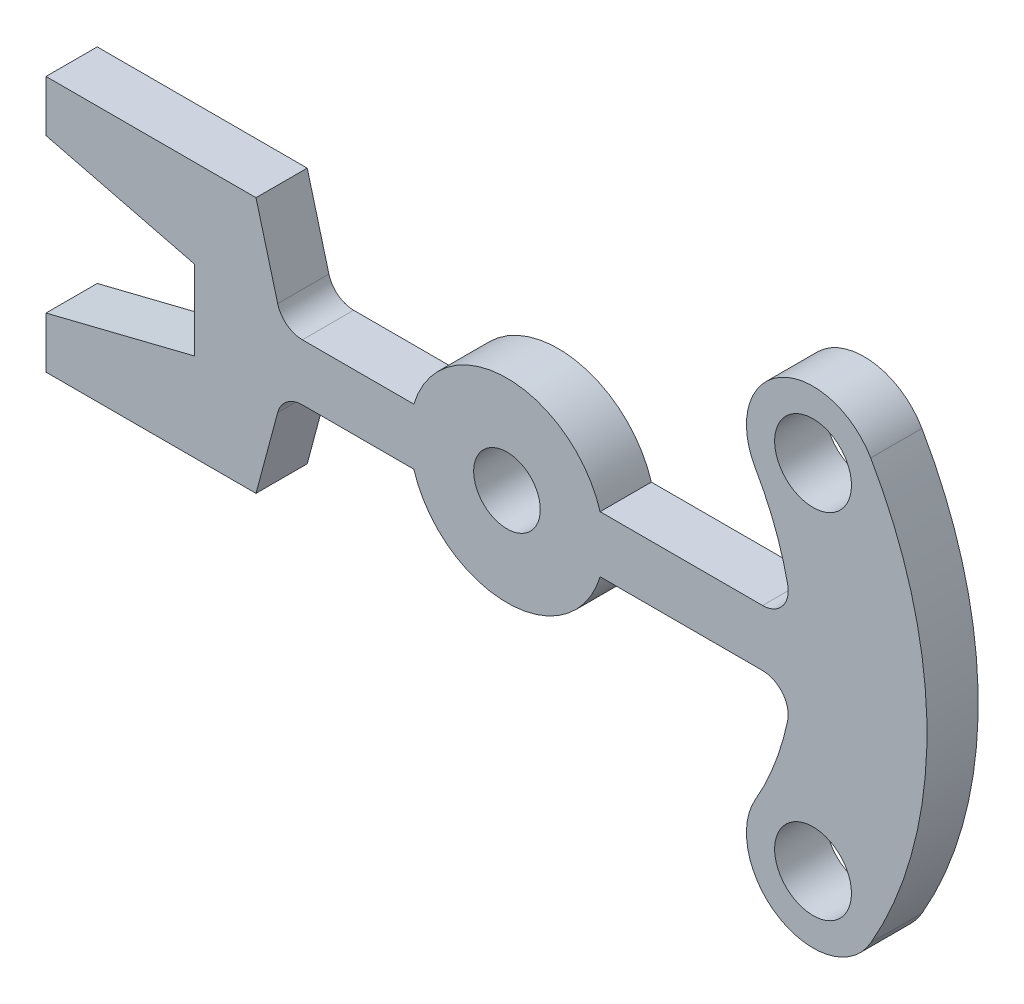
ISO-10303-21;
HEADER;
FILE_DESCRIPTION(('STEP AP214'),'2;1');
FILE_NAME('part.step','',(''),(''),'','','');
FILE_SCHEMA(('AUTOMOTIVE_DESIGN { 1 0 10303 214 1 1 1 1 }'));
ENDSEC;
DATA;
#1=APPLICATION_CONTEXT('core data for automotive mechanical design processes');
#2=APPLICATION_PROTOCOL_DEFINITION('international standard','automotive_design',2000,#1);
#3=PRODUCT_CONTEXT('',#1,'mechanical');
#4=PRODUCT('Part','Part','',(#3));
#5=PRODUCT_RELATED_PRODUCT_CATEGORY('part','',(#4));
#6=PRODUCT_DEFINITION_FORMATION('','',#4);
#7=PRODUCT_DEFINITION_CONTEXT('part definition',#1,'design');
#8=PRODUCT_DEFINITION('design','',#6,#7);
#9=PRODUCT_DEFINITION_SHAPE('','',#8);
#10=(LENGTH_UNIT() NAMED_UNIT(*) SI_UNIT(.MILLI.,.METRE.));
#11=(NAMED_UNIT(*) PLANE_ANGLE_UNIT() SI_UNIT($,.RADIAN.));
#12=(NAMED_UNIT(*) SI_UNIT($,.STERADIAN.) SOLID_ANGLE_UNIT());
#13=UNCERTAINTY_MEASURE_WITH_UNIT(LENGTH_MEASURE(1.E-05),#10,'distance_accuracy_value','');
#14=(GEOMETRIC_REPRESENTATION_CONTEXT(3) GLOBAL_UNCERTAINTY_ASSIGNED_CONTEXT((#13)) GLOBAL_UNIT_ASSIGNED_CONTEXT((#10,
#11,#12)) REPRESENTATION_CONTEXT('',''));
#15=CARTESIAN_POINT('',(0.,0.,0.));
#16=DIRECTION('',(0.,0.,1.));
#17=DIRECTION('',(1.,0.,0.));
#18=AXIS2_PLACEMENT_3D('',#15,#16,#17);
#19=CARTESIAN_POINT('',(0.,0.,10.));
#20=DIRECTION('',(0.,0.,-1.));
#21=DIRECTION('',(-1.,0.,0.));
#22=AXIS2_PLACEMENT_3D('',#19,#20,#21);
#23=CYLINDRICAL_SURFACE('',#22,19.);
#24=CARTESIAN_POINT('',(0.,0.,0.));
#25=DIRECTION('',(0.,0.,1.));
#26=DIRECTION('',(1.,0.,0.));
#27=AXIS2_PLACEMENT_3D('',#24,#25,#26);
#28=CIRCLE('',#27,19.);
#29=CARTESIAN_POINT('',(18.1865334794732,-5.5,0.));
#30=VERTEX_POINT('',#29);
#31=CARTESIAN_POINT('',(-18.1865334794732,-5.5,0.));
#32=VERTEX_POINT('',#31);
#33=EDGE_CURVE('E236',#30,#32,#28,.F.);
#34=ORIENTED_EDGE('',*,*,#33,.F.);
#35=DIRECTION('',(0.,0.,-1.));
#36=VECTOR('',#35,1.);
#37=CARTESIAN_POINT('',(18.1865334794732,-5.5,10.));
#38=LINE('',#37,#36);
#39=CARTESIAN_POINT('',(18.1865334794732,-5.5,10.));
#40=VERTEX_POINT('',#39);
#41=EDGE_CURVE('E11',#40,#30,#38,.T.);
#42=ORIENTED_EDGE('',*,*,#41,.F.);
#43=CARTESIAN_POINT('',(0.,0.,10.));
#44=DIRECTION('',(0.,0.,1.));
#45=DIRECTION('',(1.,0.,0.));
#46=AXIS2_PLACEMENT_3D('',#43,#44,#45);
#47=CIRCLE('',#46,19.);
#48=CARTESIAN_POINT('',(-18.1865334794732,-5.5,10.));
#49=VERTEX_POINT('',#48);
#50=EDGE_CURVE('E306',#40,#49,#47,.F.);
#51=ORIENTED_EDGE('',*,*,#50,.T.);
#52=DIRECTION('',(0.,0.,-1.));
#53=VECTOR('',#52,1.);
#54=CARTESIAN_POINT('',(-18.1865334794732,-5.5,10.));
#55=LINE('',#54,#53);
#56=EDGE_CURVE('E51',#49,#32,#55,.T.);
#57=ORIENTED_EDGE('',*,*,#56,.T.);
#58=EDGE_LOOP('',(#34,#42,#51,#57));
#59=FACE_BOUND('',#58,.T.);
#60=ADVANCED_FACE('F35',(#59),#23,.T.);
#61=CARTESIAN_POINT('',(0.,-5.5,10.));
#62=DIRECTION('',(0.,1.,0.));
#63=DIRECTION('',(-1.,0.,0.));
#64=AXIS2_PLACEMENT_3D('',#61,#62,#63);
#65=PLANE('',#64);
#66=DIRECTION('',(1.,0.,0.));
#67=VECTOR('',#66,1.);
#68=CARTESIAN_POINT('',(0.,-5.5,0.));
#69=LINE('',#68,#67);
#70=CARTESIAN_POINT('',(49.9074142788424,-5.5,0.));
#71=VERTEX_POINT('',#70);
#72=EDGE_CURVE('E238',#30,#71,#69,.T.);
#73=ORIENTED_EDGE('',*,*,#72,.T.);
#74=DIRECTION('',(0.,0.,-1.));
#75=VECTOR('',#74,1.);
#76=CARTESIAN_POINT('',(49.9074142788424,-5.5,10.));
#77=LINE('',#76,#75);
#78=CARTESIAN_POINT('',(49.9074142788424,-5.5,10.));
#79=VERTEX_POINT('',#78);
#80=EDGE_CURVE('E43',#79,#71,#77,.T.);
#81=ORIENTED_EDGE('',*,*,#80,.F.);
#82=DIRECTION('',(1.,0.,0.));
#83=VECTOR('',#82,1.);
#84=CARTESIAN_POINT('',(0.,-5.5,10.));
#85=LINE('',#84,#83);
#86=EDGE_CURVE('E377',#40,#79,#85,.T.);
#87=ORIENTED_EDGE('',*,*,#86,.F.);
#88=ORIENTED_EDGE('',*,*,#41,.T.);
#89=EDGE_LOOP('',(#73,#81,#87,#88));
#90=FACE_BOUND('',#89,.T.);
#91=ADVANCED_FACE('F439',(#90),#65,.F.);
#92=CARTESIAN_POINT('',(49.9074142788424,-10.5,10.));
#93=DIRECTION('',(0.,0.,-1.));
#94=DIRECTION('',(-1.,0.,0.));
#95=AXIS2_PLACEMENT_3D('',#92,#93,#94);
#96=CYLINDRICAL_SURFACE('',#95,4.99999999999999);
#97=CARTESIAN_POINT('',(49.9074142788424,-10.5,0.));
#98=DIRECTION('',(0.,0.,1.));
#99=DIRECTION('',(1.,0.,0.));
#100=AXIS2_PLACEMENT_3D('',#97,#98,#99);
#101=CIRCLE('',#100,4.99999999999999);
#102=CARTESIAN_POINT('',(54.8002980316701,-11.5294117647059,0.));
#103=VERTEX_POINT('',#102);
#104=EDGE_CURVE('E240',#71,#103,#101,.F.);
#105=ORIENTED_EDGE('',*,*,#104,.T.);
#106=DIRECTION('',(0.,0.,-1.));
#107=VECTOR('',#106,1.);
#108=CARTESIAN_POINT('',(54.8002980316701,-11.5294117647059,10.));
#109=LINE('',#108,#107);
#110=CARTESIAN_POINT('',(54.8002980316701,-11.5294117647059,10.));
#111=VERTEX_POINT('',#110);
#112=EDGE_CURVE('E348',#111,#103,#109,.T.);
#113=ORIENTED_EDGE('',*,*,#112,.F.);
#114=CARTESIAN_POINT('',(49.9074142788424,-10.5,10.));
#115=DIRECTION('',(0.,0.,1.));
#116=DIRECTION('',(1.,0.,0.));
#117=AXIS2_PLACEMENT_3D('',#114,#115,#116);
#118=CIRCLE('',#117,4.99999999999999);
#119=EDGE_CURVE('E357',#79,#111,#118,.F.);
#120=ORIENTED_EDGE('',*,*,#119,.F.);
#121=ORIENTED_EDGE('',*,*,#80,.T.);
#122=EDGE_LOOP('',(#105,#113,#120,#121));
#123=FACE_BOUND('',#122,.T.);
#124=ADVANCED_FACE('F355',(#123),#96,.F.);
#125=CARTESIAN_POINT('',(0.,0.,10.));
#126=DIRECTION('',(0.,0.,-1.));
#127=DIRECTION('',(-1.,0.,0.));
#128=AXIS2_PLACEMENT_3D('',#125,#126,#127);
#129=CYLINDRICAL_SURFACE('',#128,56.);
#130=CARTESIAN_POINT('',(0.,0.,0.));
#131=DIRECTION('',(0.,0.,1.));
#132=DIRECTION('',(1.,0.,0.));
#133=AXIS2_PLACEMENT_3D('',#130,#131,#132);
#134=CIRCLE('',#133,56.);
#135=CARTESIAN_POINT('',(48.4974226119285,-28.0000000000001,0.));
#136=VERTEX_POINT('',#135);
#137=EDGE_CURVE('E242',#103,#136,#134,.F.);
#138=ORIENTED_EDGE('',*,*,#137,.T.);
#139=DIRECTION('',(0.,0.,-1.));
#140=VECTOR('',#139,1.);
#141=CARTESIAN_POINT('',(48.4974226119285,-28.0000000000001,10.));
#142=LINE('',#141,#140);
#143=CARTESIAN_POINT('',(48.4974226119285,-28.0000000000001,10.));
#144=VERTEX_POINT('',#143);
#145=EDGE_CURVE('E346',#144,#136,#142,.T.);
#146=ORIENTED_EDGE('',*,*,#145,.F.);
#147=CARTESIAN_POINT('',(0.,0.,10.));
#148=DIRECTION('',(0.,0.,1.));
#149=DIRECTION('',(1.,0.,0.));
#150=AXIS2_PLACEMENT_3D('',#147,#148,#149);
#151=CIRCLE('',#150,56.);
#152=EDGE_CURVE('E371',#111,#144,#151,.F.);
#153=ORIENTED_EDGE('',*,*,#152,.F.);
#154=ORIENTED_EDGE('',*,*,#112,.T.);
#155=EDGE_LOOP('',(#138,#146,#153,#154));
#156=FACE_BOUND('',#155,.T.);
#157=ADVANCED_FACE('F368',(#156),#129,.F.);
#158=CARTESIAN_POINT('',(59.7557528611262,-34.5000000000001,10.));
#159=DIRECTION('',(0.,0.,-1.));
#160=DIRECTION('',(-1.,0.,0.));
#161=AXIS2_PLACEMENT_3D('',#158,#159,#160);
#162=CYLINDRICAL_SURFACE('',#161,13.);
#163=CARTESIAN_POINT('',(59.7557528611262,-34.5000000000001,0.));
#164=DIRECTION('',(0.,0.,1.));
#165=DIRECTION('',(1.,0.,0.));
#166=AXIS2_PLACEMENT_3D('',#163,#164,#165);
#167=CIRCLE('',#166,13.);
#168=CARTESIAN_POINT('',(71.0140831103239,-41.0000000000001,0.));
#169=VERTEX_POINT('',#168);
#170=EDGE_CURVE('E245',#169,#136,#167,.F.);
#171=ORIENTED_EDGE('',*,*,#170,.F.);
#172=DIRECTION('',(0.,0.,-1.));
#173=VECTOR('',#172,1.);
#174=CARTESIAN_POINT('',(71.0140831103239,-41.0000000000001,10.));
#175=LINE('',#174,#173);
#176=CARTESIAN_POINT('',(71.0140831103239,-41.0000000000001,10.));
#177=VERTEX_POINT('',#176);
#178=EDGE_CURVE('E344',#177,#169,#175,.T.);
#179=ORIENTED_EDGE('',*,*,#178,.F.);
#180=CARTESIAN_POINT('',(59.7557528611262,-34.5000000000001,10.));
#181=DIRECTION('',(0.,0.,1.));
#182=DIRECTION('',(1.,0.,0.));
#183=AXIS2_PLACEMENT_3D('',#180,#181,#182);
#184=CIRCLE('',#183,13.);
#185=EDGE_CURVE('E373',#177,#144,#184,.F.);
#186=ORIENTED_EDGE('',*,*,#185,.T.);
#187=ORIENTED_EDGE('',*,*,#145,.T.);
#188=EDGE_LOOP('',(#171,#179,#186,#187));
#189=FACE_BOUND('',#188,.T.);
#190=ADVANCED_FACE('F659',(#189),#162,.T.);
#191=CARTESIAN_POINT('',(0.,0.,10.));
#192=DIRECTION('',(0.,0.,-1.));
#193=DIRECTION('',(-1.,0.,0.));
#194=AXIS2_PLACEMENT_3D('',#191,#192,#193);
#195=CYLINDRICAL_SURFACE('',#194,82.);
#196=CARTESIAN_POINT('',(0.,0.,0.));
#197=DIRECTION('',(0.,0.,1.));
#198=DIRECTION('',(1.,0.,0.));
#199=AXIS2_PLACEMENT_3D('',#196,#197,#198);
#200=CIRCLE('',#199,82.);
#201=CARTESIAN_POINT('',(71.0140831103239,41.0000000000001,0.));
#202=VERTEX_POINT('',#201);
#203=EDGE_CURVE('E248',#169,#202,#200,.T.);
#204=ORIENTED_EDGE('',*,*,#203,.T.);
#205=DIRECTION('',(0.,0.,-1.));
#206=VECTOR('',#205,1.);
#207=CARTESIAN_POINT('',(71.0140831103239,41.0000000000001,10.));
#208=LINE('',#207,#206);
#209=CARTESIAN_POINT('',(71.0140831103239,41.0000000000001,10.));
#210=VERTEX_POINT('',#209);
#211=EDGE_CURVE('E341',#210,#202,#208,.T.);
#212=ORIENTED_EDGE('',*,*,#211,.F.);
#213=CARTESIAN_POINT('',(0.,0.,10.));
#214=DIRECTION('',(0.,0.,1.));
#215=DIRECTION('',(1.,0.,0.));
#216=AXIS2_PLACEMENT_3D('',#213,#214,#215);
#217=CIRCLE('',#216,82.);
#218=EDGE_CURVE('E375',#177,#210,#217,.T.);
#219=ORIENTED_EDGE('',*,*,#218,.F.);
#220=ORIENTED_EDGE('',*,*,#178,.T.);
#221=EDGE_LOOP('',(#204,#212,#219,#220));
#222=FACE_BOUND('',#221,.T.);
#223=ADVANCED_FACE('F649',(#222),#195,.T.);
#224=CARTESIAN_POINT('',(59.7557528611262,34.5000000000001,10.));
#225=DIRECTION('',(0.,0.,-1.));
#226=DIRECTION('',(-1.,0.,0.));
#227=AXIS2_PLACEMENT_3D('',#224,#225,#226);
#228=CYLINDRICAL_SURFACE('',#227,13.);
#229=CARTESIAN_POINT('',(59.7557528611262,34.5000000000001,0.));
#230=DIRECTION('',(0.,0.,1.));
#231=DIRECTION('',(1.,0.,0.));
#232=AXIS2_PLACEMENT_3D('',#229,#230,#231);
#233=CIRCLE('',#232,13.);
#234=CARTESIAN_POINT('',(48.4974226119285,28.0000000000001,0.));
#235=VERTEX_POINT('',#234);
#236=EDGE_CURVE('E250',#202,#235,#233,.T.);
#237=ORIENTED_EDGE('',*,*,#236,.T.);
#238=DIRECTION('',(0.,0.,-1.));
#239=VECTOR('',#238,1.);
#240=CARTESIAN_POINT('',(48.4974226119285,28.0000000000001,10.));
#241=LINE('',#240,#239);
#242=CARTESIAN_POINT('',(48.4974226119285,28.0000000000001,10.));
#243=VERTEX_POINT('',#242);
#244=EDGE_CURVE('E339',#243,#235,#241,.T.);
#245=ORIENTED_EDGE('',*,*,#244,.F.);
#246=CARTESIAN_POINT('',(59.7557528611262,34.5000000000001,10.));
#247=DIRECTION('',(0.,0.,1.));
#248=DIRECTION('',(1.,0.,0.));
#249=AXIS2_PLACEMENT_3D('',#246,#247,#248);
#250=CIRCLE('',#249,13.);
#251=EDGE_CURVE('E382',#210,#243,#250,.T.);
#252=ORIENTED_EDGE('',*,*,#251,.F.);
#253=ORIENTED_EDGE('',*,*,#211,.T.);
#254=EDGE_LOOP('',(#237,#245,#252,#253));
#255=FACE_BOUND('',#254,.T.);
#256=ADVANCED_FACE('F639',(#255),#228,.T.);
#257=CARTESIAN_POINT('',(0.,0.,10.));
#258=DIRECTION('',(0.,0.,-1.));
#259=DIRECTION('',(-1.,0.,0.));
#260=AXIS2_PLACEMENT_3D('',#257,#258,#259);
#261=CYLINDRICAL_SURFACE('',#260,56.);
#262=CARTESIAN_POINT('',(0.,0.,0.));
#263=DIRECTION('',(0.,0.,1.));
#264=DIRECTION('',(1.,0.,0.));
#265=AXIS2_PLACEMENT_3D('',#262,#263,#264);
#266=CIRCLE('',#265,56.);
#267=CARTESIAN_POINT('',(54.8002980316701,11.5294117647059,0.));
#268=VERTEX_POINT('',#267);
#269=EDGE_CURVE('E253',#268,#235,#266,.T.);
#270=ORIENTED_EDGE('',*,*,#269,.F.);
#271=DIRECTION('',(0.,0.,-1.));
#272=VECTOR('',#271,1.);
#273=CARTESIAN_POINT('',(54.8002980316701,11.5294117647059,10.));
#274=LINE('',#273,#272);
#275=CARTESIAN_POINT('',(54.8002980316701,11.5294117647059,10.));
#276=VERTEX_POINT('',#275);
#277=EDGE_CURVE('E337',#276,#268,#274,.T.);
#278=ORIENTED_EDGE('',*,*,#277,.F.);
#279=CARTESIAN_POINT('',(0.,0.,10.));
#280=DIRECTION('',(0.,0.,1.));
#281=DIRECTION('',(1.,0.,0.));
#282=AXIS2_PLACEMENT_3D('',#279,#280,#281);
#283=CIRCLE('',#282,56.);
#284=EDGE_CURVE('E384',#276,#243,#283,.T.);
#285=ORIENTED_EDGE('',*,*,#284,.T.);
#286=ORIENTED_EDGE('',*,*,#244,.T.);
#287=EDGE_LOOP('',(#270,#278,#285,#286));
#288=FACE_BOUND('',#287,.T.);
#289=ADVANCED_FACE('F629',(#288),#261,.F.);
#290=CARTESIAN_POINT('',(49.9074142788424,10.5,10.));
#291=DIRECTION('',(0.,0.,-1.));
#292=DIRECTION('',(-1.,0.,0.));
#293=AXIS2_PLACEMENT_3D('',#290,#291,#292);
#294=CYLINDRICAL_SURFACE('',#293,4.99999999999999);
#295=CARTESIAN_POINT('',(49.9074142788424,10.5,0.));
#296=DIRECTION('',(0.,0.,1.));
#297=DIRECTION('',(1.,0.,0.));
#298=AXIS2_PLACEMENT_3D('',#295,#296,#297);
#299=CIRCLE('',#298,4.99999999999999);
#300=CARTESIAN_POINT('',(49.9074142788424,5.5,0.));
#301=VERTEX_POINT('',#300);
#302=EDGE_CURVE('E256',#301,#268,#299,.T.);
#303=ORIENTED_EDGE('',*,*,#302,.F.);
#304=DIRECTION('',(0.,0.,-1.));
#305=VECTOR('',#304,1.);
#306=CARTESIAN_POINT('',(49.9074142788424,5.5,10.));
#307=LINE('',#306,#305);
#308=CARTESIAN_POINT('',(49.9074142788424,5.5,10.));
#309=VERTEX_POINT('',#308);
#310=EDGE_CURVE('E335',#309,#301,#307,.T.);
#311=ORIENTED_EDGE('',*,*,#310,.F.);
#312=CARTESIAN_POINT('',(49.9074142788424,10.5,10.));
#313=DIRECTION('',(0.,0.,1.));
#314=DIRECTION('',(1.,0.,0.));
#315=AXIS2_PLACEMENT_3D('',#312,#313,#314);
#316=CIRCLE('',#315,4.99999999999999);
#317=EDGE_CURVE('E387',#309,#276,#316,.T.);
#318=ORIENTED_EDGE('',*,*,#317,.T.);
#319=ORIENTED_EDGE('',*,*,#277,.T.);
#320=EDGE_LOOP('',(#303,#311,#318,#319));
#321=FACE_BOUND('',#320,.T.);
#322=ADVANCED_FACE('F619',(#321),#294,.F.);
#323=CARTESIAN_POINT('',(0.,5.5,10.));
#324=DIRECTION('',(0.,1.,0.));
#325=DIRECTION('',(-1.,0.,0.));
#326=AXIS2_PLACEMENT_3D('',#323,#324,#325);
#327=PLANE('',#326);
#328=DIRECTION('',(1.,0.,0.));
#329=VECTOR('',#328,1.);
#330=CARTESIAN_POINT('',(0.,5.5,0.));
#331=LINE('',#330,#329);
#332=CARTESIAN_POINT('',(18.1865334794732,5.5,0.));
#333=VERTEX_POINT('',#332);
#334=EDGE_CURVE('E259',#333,#301,#331,.T.);
#335=ORIENTED_EDGE('',*,*,#334,.F.);
#336=DIRECTION('',(0.,0.,-1.));
#337=VECTOR('',#336,1.);
#338=CARTESIAN_POINT('',(18.1865334794732,5.5,10.));
#339=LINE('',#338,#337);
#340=CARTESIAN_POINT('',(18.1865334794732,5.5,10.));
#341=VERTEX_POINT('',#340);
#342=EDGE_CURVE('E333',#341,#333,#339,.T.);
#343=ORIENTED_EDGE('',*,*,#342,.F.);
#344=DIRECTION('',(1.,0.,0.));
#345=VECTOR('',#344,1.);
#346=CARTESIAN_POINT('',(0.,5.5,10.));
#347=LINE('',#346,#345);
#348=EDGE_CURVE('E390',#341,#309,#347,.T.);
#349=ORIENTED_EDGE('',*,*,#348,.T.);
#350=ORIENTED_EDGE('',*,*,#310,.T.);
#351=EDGE_LOOP('',(#335,#343,#349,#350));
#352=FACE_BOUND('',#351,.T.);
#353=ADVANCED_FACE('F609',(#352),#327,.T.);
#354=CARTESIAN_POINT('',(0.,0.,10.));
#355=DIRECTION('',(0.,0.,-1.));
#356=DIRECTION('',(-1.,0.,0.));
#357=AXIS2_PLACEMENT_3D('',#354,#355,#356);
#358=CYLINDRICAL_SURFACE('',#357,19.);
#359=CARTESIAN_POINT('',(0.,0.,0.));
#360=DIRECTION('',(0.,0.,1.));
#361=DIRECTION('',(1.,0.,0.));
#362=AXIS2_PLACEMENT_3D('',#359,#360,#361);
#363=CIRCLE('',#362,19.);
#364=CARTESIAN_POINT('',(-18.1865334794732,5.5,0.));
#365=VERTEX_POINT('',#364);
#366=EDGE_CURVE('E262',#333,#365,#363,.T.);
#367=ORIENTED_EDGE('',*,*,#366,.T.);
#368=DIRECTION('',(0.,0.,-1.));
#369=VECTOR('',#368,1.);
#370=CARTESIAN_POINT('',(-18.1865334794732,5.5,10.));
#371=LINE('',#370,#369);
#372=CARTESIAN_POINT('',(-18.1865334794732,5.5,10.));
#373=VERTEX_POINT('',#372);
#374=EDGE_CURVE('E330',#373,#365,#371,.T.);
#375=ORIENTED_EDGE('',*,*,#374,.F.);
#376=CARTESIAN_POINT('',(0.,0.,10.));
#377=DIRECTION('',(0.,0.,1.));
#378=DIRECTION('',(1.,0.,0.));
#379=AXIS2_PLACEMENT_3D('',#376,#377,#378);
#380=CIRCLE('',#379,19.);
#381=EDGE_CURVE('E393',#341,#373,#380,.T.);
#382=ORIENTED_EDGE('',*,*,#381,.F.);
#383=ORIENTED_EDGE('',*,*,#342,.T.);
#384=EDGE_LOOP('',(#367,#375,#382,#383));
#385=FACE_BOUND('',#384,.T.);
#386=ADVANCED_FACE('F599',(#385),#358,.T.);
#387=CARTESIAN_POINT('',(0.,5.5,10.));
#388=DIRECTION('',(0.,-1.,0.));
#389=DIRECTION('',(1.,0.,0.));
#390=AXIS2_PLACEMENT_3D('',#387,#388,#389);
#391=PLANE('',#390);
#392=DIRECTION('',(-1.,0.,0.));
#393=VECTOR('',#392,1.);
#394=CARTESIAN_POINT('',(0.,5.5,0.));
#395=LINE('',#394,#393);
#396=CARTESIAN_POINT('',(-39.9383558076983,5.5,0.));
#397=VERTEX_POINT('',#396);
#398=EDGE_CURVE('E264',#365,#397,#395,.T.);
#399=ORIENTED_EDGE('',*,*,#398,.T.);
#400=DIRECTION('',(0.,0.,-1.));
#401=VECTOR('',#400,1.);
#402=CARTESIAN_POINT('',(-39.9383558076983,5.5,10.));
#403=LINE('',#402,#401);
#404=CARTESIAN_POINT('',(-39.9383558076983,5.5,10.));
#405=VERTEX_POINT('',#404);
#406=EDGE_CURVE('E328',#405,#397,#403,.T.);
#407=ORIENTED_EDGE('',*,*,#406,.F.);
#408=DIRECTION('',(-1.,0.,0.));
#409=VECTOR('',#408,1.);
#410=CARTESIAN_POINT('',(0.,5.5,10.));
#411=LINE('',#410,#409);
#412=EDGE_CURVE('E395',#373,#405,#411,.T.);
#413=ORIENTED_EDGE('',*,*,#412,.F.);
#414=ORIENTED_EDGE('',*,*,#374,.T.);
#415=EDGE_LOOP('',(#399,#407,#413,#414));
#416=FACE_BOUND('',#415,.T.);
#417=ADVANCED_FACE('F589',(#416),#391,.F.);
#418=CARTESIAN_POINT('',(-39.9383558076983,10.5,10.));
#419=DIRECTION('',(0.,0.,-1.));
#420=DIRECTION('',(-1.,0.,0.));
#421=AXIS2_PLACEMENT_3D('',#418,#419,#420);
#422=CYLINDRICAL_SURFACE('',#421,5.);
#423=CARTESIAN_POINT('',(-39.9383558076983,10.5,0.));
#424=DIRECTION('',(0.,0.,1.));
#425=DIRECTION('',(1.,0.,0.));
#426=AXIS2_PLACEMENT_3D('',#423,#424,#425);
#427=CIRCLE('',#426,5.);
#428=CARTESIAN_POINT('',(-44.7679849391436,9.20590477448739,0.));
#429=VERTEX_POINT('',#428);
#430=EDGE_CURVE('E267',#429,#397,#427,.T.);
#431=ORIENTED_EDGE('',*,*,#430,.F.);
#432=DIRECTION('',(0.,0.,-1.));
#433=VECTOR('',#432,1.);
#434=CARTESIAN_POINT('',(-44.7679849391436,9.20590477448739,10.));
#435=LINE('',#434,#433);
#436=CARTESIAN_POINT('',(-44.7679849391436,9.20590477448739,10.));
#437=VERTEX_POINT('',#436);
#438=EDGE_CURVE('E326',#437,#429,#435,.T.);
#439=ORIENTED_EDGE('',*,*,#438,.F.);
#440=CARTESIAN_POINT('',(-39.9383558076983,10.5,10.));
#441=DIRECTION('',(0.,0.,1.));
#442=DIRECTION('',(1.,0.,0.));
#443=AXIS2_PLACEMENT_3D('',#440,#441,#442);
#444=CIRCLE('',#443,5.);
#445=EDGE_CURVE('E397',#437,#405,#444,.T.);
#446=ORIENTED_EDGE('',*,*,#445,.T.);
#447=ORIENTED_EDGE('',*,*,#406,.T.);
#448=EDGE_LOOP('',(#431,#439,#446,#447));
#449=FACE_BOUND('',#448,.T.);
#450=ADVANCED_FACE('F579',(#449),#422,.F.);
#451=CARTESIAN_POINT('',(-39.4676223927187,-10.5753175473055,10.));
#452=DIRECTION('',(0.965925826289068,0.258819045102521,0.));
#453=DIRECTION('',(-0.258819045102521,0.965925826289068,0.));
#454=AXIS2_PLACEMENT_3D('',#451,#452,#453);
#455=PLANE('',#454);
#456=DIRECTION('',(0.258819045102521,-0.965925826289068,0.));
#457=VECTOR('',#456,1.);
#458=CARTESIAN_POINT('',(-39.4676223927187,-10.5753175473055,0.));
#459=LINE('',#458,#457);
#460=CARTESIAN_POINT('',(-49.,25.,0.));
#461=VERTEX_POINT('',#460);
#462=EDGE_CURVE('E270',#461,#429,#459,.T.);
#463=ORIENTED_EDGE('',*,*,#462,.F.);
#464=DIRECTION('',(0.,0.,-1.));
#465=VECTOR('',#464,1.);
#466=CARTESIAN_POINT('',(-49.,25.,10.));
#467=LINE('',#466,#465);
#468=CARTESIAN_POINT('',(-49.,25.,10.));
#469=VERTEX_POINT('',#468);
#470=EDGE_CURVE('E324',#469,#461,#467,.T.);
#471=ORIENTED_EDGE('',*,*,#470,.F.);
#472=DIRECTION('',(0.258819045102521,-0.965925826289068,0.));
#473=VECTOR('',#472,1.);
#474=CARTESIAN_POINT('',(-39.4676223927187,-10.5753175473055,10.));
#475=LINE('',#474,#473);
#476=EDGE_CURVE('E400',#469,#437,#475,.T.);
#477=ORIENTED_EDGE('',*,*,#476,.T.);
#478=ORIENTED_EDGE('',*,*,#438,.T.);
#479=EDGE_LOOP('',(#463,#471,#477,#478));
#480=FACE_BOUND('',#479,.T.);
#481=ADVANCED_FACE('F568',(#480),#455,.T.);
#482=CARTESIAN_POINT('',(0.,25.,10.));
#483=DIRECTION('',(0.,1.,0.));
#484=DIRECTION('',(0.,0.,1.));
#485=AXIS2_PLACEMENT_3D('',#482,#483,#484);
#486=PLANE('',#485);
#487=DIRECTION('',(1.,0.,0.));
#488=VECTOR('',#487,1.);
#489=CARTESIAN_POINT('',(0.,25.,0.));
#490=LINE('',#489,#488);
#491=CARTESIAN_POINT('',(-90.,25.,0.));
#492=VERTEX_POINT('',#491);
#493=EDGE_CURVE('E273',#492,#461,#490,.T.);
#494=ORIENTED_EDGE('',*,*,#493,.F.);
#495=DIRECTION('',(0.,0.,-1.));
#496=VECTOR('',#495,1.);
#497=CARTESIAN_POINT('',(-90.,25.,10.));
#498=LINE('',#497,#496);
#499=CARTESIAN_POINT('',(-90.,25.,10.));
#500=VERTEX_POINT('',#499);
#501=EDGE_CURVE('E322',#500,#492,#498,.T.);
#502=ORIENTED_EDGE('',*,*,#501,.F.);
#503=DIRECTION('',(1.,0.,0.));
#504=VECTOR('',#503,1.);
#505=CARTESIAN_POINT('',(0.,25.,10.));
#506=LINE('',#505,#504);
#507=EDGE_CURVE('E403',#500,#469,#506,.T.);
#508=ORIENTED_EDGE('',*,*,#507,.T.);
#509=ORIENTED_EDGE('',*,*,#470,.T.);
#510=EDGE_LOOP('',(#494,#502,#508,#509));
#511=FACE_BOUND('',#510,.T.);
#512=ADVANCED_FACE('F558',(#511),#486,.T.);
#513=CARTESIAN_POINT('',(-90.,0.,10.));
#514=DIRECTION('',(1.,0.,0.));
#515=DIRECTION('',(0.,0.,-1.));
#516=AXIS2_PLACEMENT_3D('',#513,#514,#515);
#517=PLANE('',#516);
#518=DIRECTION('',(0.,-1.,0.));
#519=VECTOR('',#518,1.);
#520=CARTESIAN_POINT('',(-90.,0.,0.));
#521=LINE('',#520,#519);
#522=CARTESIAN_POINT('',(-90.,15.,0.));
#523=VERTEX_POINT('',#522);
#524=EDGE_CURVE('E276',#492,#523,#521,.T.);
#525=ORIENTED_EDGE('',*,*,#524,.T.);
#526=DIRECTION('',(0.,0.,-1.));
#527=VECTOR('',#526,1.);
#528=CARTESIAN_POINT('',(-90.,15.,10.));
#529=LINE('',#528,#527);
#530=CARTESIAN_POINT('',(-90.,15.,10.));
#531=VERTEX_POINT('',#530);
#532=EDGE_CURVE('E319',#531,#523,#529,.T.);
#533=ORIENTED_EDGE('',*,*,#532,.F.);
#534=DIRECTION('',(0.,-1.,0.));
#535=VECTOR('',#534,1.);
#536=CARTESIAN_POINT('',(-90.,0.,10.));
#537=LINE('',#536,#535);
#538=EDGE_CURVE('E406',#500,#531,#537,.T.);
#539=ORIENTED_EDGE('',*,*,#538,.F.);
#540=ORIENTED_EDGE('',*,*,#501,.T.);
#541=EDGE_LOOP('',(#525,#533,#539,#540));
#542=FACE_BOUND('',#541,.T.);
#543=ADVANCED_FACE('F548',(#542),#517,.F.);
#544=CARTESIAN_POINT('',(-1.74632160045402,-7.00411337892287,10.));
#545=DIRECTION('',(0.241921895599665,0.970295726275997,0.));
#546=DIRECTION('',(-0.970295726275997,0.241921895599665,0.));
#547=AXIS2_PLACEMENT_3D('',#544,#545,#546);
#548=PLANE('',#547);
#549=DIRECTION('',(0.970295726275997,-0.241921895599665,0.));
#550=VECTOR('',#549,1.);
#551=CARTESIAN_POINT('',(-1.74632160045402,-7.00411337892287,0.));
#552=LINE('',#551,#550);
#553=CARTESIAN_POINT('',(-61.,7.76948791754785,0.));
#554=VERTEX_POINT('',#553);
#555=EDGE_CURVE('E278',#523,#554,#552,.T.);
#556=ORIENTED_EDGE('',*,*,#555,.T.);
#557=DIRECTION('',(0.,0.,-1.));
#558=VECTOR('',#557,1.);
#559=CARTESIAN_POINT('',(-61.,7.76948791754785,10.));
#560=LINE('',#559,#558);
#561=CARTESIAN_POINT('',(-61.,7.76948791754785,10.));
#562=VERTEX_POINT('',#561);
#563=EDGE_CURVE('E316',#562,#554,#560,.T.);
#564=ORIENTED_EDGE('',*,*,#563,.F.);
#565=DIRECTION('',(0.970295726275997,-0.241921895599665,0.));
#566=VECTOR('',#565,1.);
#567=CARTESIAN_POINT('',(-1.74632160045402,-7.00411337892287,10.));
#568=LINE('',#567,#566);
#569=EDGE_CURVE('E408',#531,#562,#568,.T.);
#570=ORIENTED_EDGE('',*,*,#569,.F.);
#571=ORIENTED_EDGE('',*,*,#532,.T.);
#572=EDGE_LOOP('',(#556,#564,#570,#571));
#573=FACE_BOUND('',#572,.T.);
#574=ADVANCED_FACE('F538',(#573),#548,.F.);
#575=CARTESIAN_POINT('',(-61.,0.,10.));
#576=DIRECTION('',(1.,0.,0.));
#577=DIRECTION('',(0.,0.,-1.));
#578=AXIS2_PLACEMENT_3D('',#575,#576,#577);
#579=PLANE('',#578);
#580=DIRECTION('',(0.,-1.,0.));
#581=VECTOR('',#580,1.);
#582=CARTESIAN_POINT('',(-61.,0.,0.));
#583=LINE('',#582,#581);
#584=CARTESIAN_POINT('',(-61.,-7.76948791754785,0.));
#585=VERTEX_POINT('',#584);
#586=EDGE_CURVE('E280',#554,#585,#583,.T.);
#587=ORIENTED_EDGE('',*,*,#586,.T.);
#588=DIRECTION('',(0.,0.,-1.));
#589=VECTOR('',#588,1.);
#590=CARTESIAN_POINT('',(-61.,-7.76948791754785,10.));
#591=LINE('',#590,#589);
#592=CARTESIAN_POINT('',(-61.,-7.76948791754785,10.));
#593=VERTEX_POINT('',#592);
#594=EDGE_CURVE('E314',#593,#585,#591,.T.);
#595=ORIENTED_EDGE('',*,*,#594,.F.);
#596=DIRECTION('',(0.,-1.,0.));
#597=VECTOR('',#596,1.);
#598=CARTESIAN_POINT('',(-61.,0.,10.));
#599=LINE('',#598,#597);
#600=EDGE_CURVE('E410',#562,#593,#599,.T.);
#601=ORIENTED_EDGE('',*,*,#600,.F.);
#602=ORIENTED_EDGE('',*,*,#563,.T.);
#603=EDGE_LOOP('',(#587,#595,#601,#602));
#604=FACE_BOUND('',#603,.T.);
#605=ADVANCED_FACE('F529',(#604),#579,.F.);
#606=CARTESIAN_POINT('',(-1.74632160045402,7.00411337892287,10.));
#607=DIRECTION('',(-0.241921895599665,0.970295726275997,0.));
#608=DIRECTION('',(-0.970295726275997,-0.241921895599665,0.));
#609=AXIS2_PLACEMENT_3D('',#606,#607,#608);
#610=PLANE('',#609);
#611=DIRECTION('',(0.970295726275997,0.241921895599665,0.));
#612=VECTOR('',#611,1.);
#613=CARTESIAN_POINT('',(-1.74632160045402,7.00411337892287,0.));
#614=LINE('',#613,#612);
#615=CARTESIAN_POINT('',(-90.,-15.,0.));
#616=VERTEX_POINT('',#615);
#617=EDGE_CURVE('E283',#616,#585,#614,.T.);
#618=ORIENTED_EDGE('',*,*,#617,.F.);
#619=DIRECTION('',(0.,0.,-1.));
#620=VECTOR('',#619,1.);
#621=CARTESIAN_POINT('',(-90.,-15.,10.));
#622=LINE('',#621,#620);
#623=CARTESIAN_POINT('',(-90.,-15.,10.));
#624=VERTEX_POINT('',#623);
#625=EDGE_CURVE('E312',#624,#616,#622,.T.);
#626=ORIENTED_EDGE('',*,*,#625,.F.);
#627=DIRECTION('',(0.970295726275997,0.241921895599665,0.));
#628=VECTOR('',#627,1.);
#629=CARTESIAN_POINT('',(-1.74632160045402,7.00411337892287,10.));
#630=LINE('',#629,#628);
#631=EDGE_CURVE('E412',#624,#593,#630,.T.);
#632=ORIENTED_EDGE('',*,*,#631,.T.);
#633=ORIENTED_EDGE('',*,*,#594,.T.);
#634=EDGE_LOOP('',(#618,#626,#632,#633));
#635=FACE_BOUND('',#634,.T.);
#636=ADVANCED_FACE('F425',(#635),#610,.T.);
#637=CARTESIAN_POINT('',(-90.,0.,10.));
#638=DIRECTION('',(-1.,0.,0.));
#639=DIRECTION('',(0.,0.,1.));
#640=AXIS2_PLACEMENT_3D('',#637,#638,#639);
#641=PLANE('',#640);
#642=DIRECTION('',(0.,1.,0.));
#643=VECTOR('',#642,1.);
#644=CARTESIAN_POINT('',(-90.,0.,0.));
#645=LINE('',#644,#643);
#646=CARTESIAN_POINT('',(-90.,-25.,0.));
#647=VERTEX_POINT('',#646);
#648=EDGE_CURVE('E286',#647,#616,#645,.T.);
#649=ORIENTED_EDGE('',*,*,#648,.F.);
#650=DIRECTION('',(0.,0.,-1.));
#651=VECTOR('',#650,1.);
#652=CARTESIAN_POINT('',(-90.,-25.,10.));
#653=LINE('',#652,#651);
#654=CARTESIAN_POINT('',(-90.,-25.,10.));
#655=VERTEX_POINT('',#654);
#656=EDGE_CURVE('E310',#655,#647,#653,.T.);
#657=ORIENTED_EDGE('',*,*,#656,.F.);
#658=DIRECTION('',(0.,1.,0.));
#659=VECTOR('',#658,1.);
#660=CARTESIAN_POINT('',(-90.,0.,10.));
#661=LINE('',#660,#659);
#662=EDGE_CURVE('E415',#655,#624,#661,.T.);
#663=ORIENTED_EDGE('',*,*,#662,.T.);
#664=ORIENTED_EDGE('',*,*,#625,.T.);
#665=EDGE_LOOP('',(#649,#657,#663,#664));
#666=FACE_BOUND('',#665,.T.);
#667=ADVANCED_FACE('F419',(#666),#641,.T.);
#668=CARTESIAN_POINT('',(0.,-25.,10.));
#669=DIRECTION('',(0.,1.,0.));
#670=DIRECTION('',(0.,0.,1.));
#671=AXIS2_PLACEMENT_3D('',#668,#669,#670);
#672=PLANE('',#671);
#673=DIRECTION('',(1.,0.,0.));
#674=VECTOR('',#673,1.);
#675=CARTESIAN_POINT('',(0.,-25.,0.));
#676=LINE('',#675,#674);
#677=CARTESIAN_POINT('',(-49.,-25.,0.));
#678=VERTEX_POINT('',#677);
#679=EDGE_CURVE('E289',#647,#678,#676,.T.);
#680=ORIENTED_EDGE('',*,*,#679,.T.);
#681=DIRECTION('',(0.,0.,-1.));
#682=VECTOR('',#681,1.);
#683=CARTESIAN_POINT('',(-49.,-25.,10.));
#684=LINE('',#683,#682);
#685=CARTESIAN_POINT('',(-49.,-25.,10.));
#686=VERTEX_POINT('',#685);
#687=EDGE_CURVE('E219',#686,#678,#684,.T.);
#688=ORIENTED_EDGE('',*,*,#687,.F.);
#689=DIRECTION('',(1.,0.,0.));
#690=VECTOR('',#689,1.);
#691=CARTESIAN_POINT('',(0.,-25.,10.));
#692=LINE('',#691,#690);
#693=EDGE_CURVE('E207',#655,#686,#692,.T.);
#694=ORIENTED_EDGE('',*,*,#693,.F.);
#695=ORIENTED_EDGE('',*,*,#656,.T.);
#696=EDGE_LOOP('',(#680,#688,#694,#695));
#697=FACE_BOUND('',#696,.T.);
#698=ADVANCED_FACE('F429',(#697),#672,.F.);
#699=CARTESIAN_POINT('',(-39.4676223927187,10.5753175473055,10.));
#700=DIRECTION('',(-0.965925826289068,0.258819045102521,0.));
#701=DIRECTION('',(-0.258819045102521,-0.965925826289068,0.));
#702=AXIS2_PLACEMENT_3D('',#699,#700,#701);
#703=PLANE('',#702);
#704=DIRECTION('',(0.258819045102521,0.965925826289068,0.));
#705=VECTOR('',#704,1.);
#706=CARTESIAN_POINT('',(-39.4676223927187,10.5753175473055,0.));
#707=LINE('',#706,#705);
#708=CARTESIAN_POINT('',(-44.7679849391436,-9.20590477448738,0.));
#709=VERTEX_POINT('',#708);
#710=EDGE_CURVE('E216',#678,#709,#707,.T.);
#711=ORIENTED_EDGE('',*,*,#710,.T.);
#712=DIRECTION('',(0.,0.,-1.));
#713=VECTOR('',#712,1.);
#714=CARTESIAN_POINT('',(-44.7679849391436,-9.20590477448738,10.));
#715=LINE('',#714,#713);
#716=CARTESIAN_POINT('',(-44.7679849391436,-9.20590477448738,10.));
#717=VERTEX_POINT('',#716);
#718=EDGE_CURVE('E213',#717,#709,#715,.T.);
#719=ORIENTED_EDGE('',*,*,#718,.F.);
#720=DIRECTION('',(0.258819045102521,0.965925826289068,0.));
#721=VECTOR('',#720,1.);
#722=CARTESIAN_POINT('',(-39.4676223927187,10.5753175473055,10.));
#723=LINE('',#722,#721);
#724=EDGE_CURVE('E197',#686,#717,#723,.T.);
#725=ORIENTED_EDGE('',*,*,#724,.F.);
#726=ORIENTED_EDGE('',*,*,#687,.T.);
#727=EDGE_LOOP('',(#711,#719,#725,#726));
#728=FACE_BOUND('',#727,.T.);
#729=ADVANCED_FACE('F214',(#728),#703,.F.);
#730=CARTESIAN_POINT('',(-39.9383558076983,-10.5,10.));
#731=DIRECTION('',(0.,0.,-1.));
#732=DIRECTION('',(-1.,0.,0.));
#733=AXIS2_PLACEMENT_3D('',#730,#731,#732);
#734=CYLINDRICAL_SURFACE('',#733,5.);
#735=CARTESIAN_POINT('',(-39.9383558076983,-10.5,0.));
#736=DIRECTION('',(0.,0.,1.));
#737=DIRECTION('',(1.,0.,0.));
#738=AXIS2_PLACEMENT_3D('',#735,#736,#737);
#739=CIRCLE('',#738,5.);
#740=CARTESIAN_POINT('',(-39.9383558076983,-5.5,0.));
#741=VERTEX_POINT('',#740);
#742=EDGE_CURVE('E292',#709,#741,#739,.F.);
#743=ORIENTED_EDGE('',*,*,#742,.T.);
#744=DIRECTION('',(0.,0.,-1.));
#745=VECTOR('',#744,1.);
#746=CARTESIAN_POINT('',(-39.9383558076983,-5.5,10.));
#747=LINE('',#746,#745);
#748=CARTESIAN_POINT('',(-39.9383558076983,-5.5,10.));
#749=VERTEX_POINT('',#748);
#750=EDGE_CURVE('E125',#749,#741,#747,.T.);
#751=ORIENTED_EDGE('',*,*,#750,.F.);
#752=CARTESIAN_POINT('',(-39.9383558076983,-10.5,10.));
#753=DIRECTION('',(0.,0.,1.));
#754=DIRECTION('',(1.,0.,0.));
#755=AXIS2_PLACEMENT_3D('',#752,#753,#754);
#756=CIRCLE('',#755,5.);
#757=EDGE_CURVE('E204',#717,#749,#756,.F.);
#758=ORIENTED_EDGE('',*,*,#757,.F.);
#759=ORIENTED_EDGE('',*,*,#718,.T.);
#760=EDGE_LOOP('',(#743,#751,#758,#759));
#761=FACE_BOUND('',#760,.T.);
#762=ADVANCED_FACE('F221',(#761),#734,.F.);
#763=CARTESIAN_POINT('',(59.7557528611262,34.5000000000001,10.));
#764=DIRECTION('',(0.,0.,-1.));
#765=DIRECTION('',(-1.,0.,0.));
#766=AXIS2_PLACEMENT_3D('',#763,#764,#765);
#767=CYLINDRICAL_SURFACE('',#766,7.5);
#768=CARTESIAN_POINT('',(59.7557528611262,34.5000000000001,10.));
#769=DIRECTION('',(0.,0.,1.));
#770=DIRECTION('',(1.,0.,0.));
#771=AXIS2_PLACEMENT_3D('',#768,#769,#770);
#772=CIRCLE('',#771,7.5);
#773=CARTESIAN_POINT('',(67.2557528611262,34.5000000000001,10.));
#774=VERTEX_POINT('',#773);
#775=EDGE_CURVE('E230',#774,#774,#772,.T.);
#776=ORIENTED_EDGE('',*,*,#775,.T.);
#777=EDGE_LOOP('',(#776));
#778=FACE_BOUND('',#777,.T.);
#779=CARTESIAN_POINT('',(59.7557528611262,34.5000000000001,0.));
#780=DIRECTION('',(0.,0.,1.));
#781=DIRECTION('',(1.,0.,0.));
#782=AXIS2_PLACEMENT_3D('',#779,#780,#781);
#783=CIRCLE('',#782,7.5);
#784=CARTESIAN_POINT('',(67.2557528611262,34.5000000000001,0.));
#785=VERTEX_POINT('',#784);
#786=EDGE_CURVE('E300',#785,#785,#783,.T.);
#787=ORIENTED_EDGE('',*,*,#786,.F.);
#788=EDGE_LOOP('',(#787));
#789=FACE_BOUND('',#788,.T.);
#790=ADVANCED_FACE('F454',(#778,#789),#767,.F.);
#791=CARTESIAN_POINT('',(0.,0.,10.));
#792=DIRECTION('',(0.,0.,-1.));
#793=DIRECTION('',(-1.,0.,0.));
#794=AXIS2_PLACEMENT_3D('',#791,#792,#793);
#795=CYLINDRICAL_SURFACE('',#794,6.5);
#796=CARTESIAN_POINT('',(0.,0.,10.));
#797=DIRECTION('',(0.,0.,1.));
#798=DIRECTION('',(1.,0.,0.));
#799=AXIS2_PLACEMENT_3D('',#796,#797,#798);
#800=CIRCLE('',#799,6.5);
#801=CARTESIAN_POINT('',(6.5,0.,10.));
#802=VERTEX_POINT('',#801);
#803=EDGE_CURVE('E224',#802,#802,#800,.T.);
#804=ORIENTED_EDGE('',*,*,#803,.T.);
#805=EDGE_LOOP('',(#804));
#806=FACE_BOUND('',#805,.T.);
#807=CARTESIAN_POINT('',(0.,0.,0.));
#808=DIRECTION('',(0.,0.,1.));
#809=DIRECTION('',(1.,0.,0.));
#810=AXIS2_PLACEMENT_3D('',#807,#808,#809);
#811=CIRCLE('',#810,6.5);
#812=CARTESIAN_POINT('',(6.5,0.,0.));
#813=VERTEX_POINT('',#812);
#814=EDGE_CURVE('E297',#813,#813,#811,.T.);
#815=ORIENTED_EDGE('',*,*,#814,.F.);
#816=EDGE_LOOP('',(#815));
#817=FACE_BOUND('',#816,.T.);
#818=ADVANCED_FACE('F446',(#806,#817),#795,.F.);
#819=CARTESIAN_POINT('',(0.,-5.5,10.));
#820=DIRECTION('',(0.,-1.,0.));
#821=DIRECTION('',(1.,0.,0.));
#822=AXIS2_PLACEMENT_3D('',#819,#820,#821);
#823=PLANE('',#822);
#824=DIRECTION('',(-1.,0.,0.));
#825=VECTOR('',#824,1.);
#826=CARTESIAN_POINT('',(0.,-5.5,0.));
#827=LINE('',#826,#825);
#828=EDGE_CURVE('E294',#32,#741,#827,.T.);
#829=ORIENTED_EDGE('',*,*,#828,.F.);
#830=ORIENTED_EDGE('',*,*,#56,.F.);
#831=DIRECTION('',(-1.,0.,0.));
#832=VECTOR('',#831,1.);
#833=CARTESIAN_POINT('',(0.,-5.5,10.));
#834=LINE('',#833,#832);
#835=EDGE_CURVE('E222',#49,#749,#834,.T.);
#836=ORIENTED_EDGE('',*,*,#835,.T.);
#837=ORIENTED_EDGE('',*,*,#750,.T.);
#838=EDGE_LOOP('',(#829,#830,#836,#837));
#839=FACE_BOUND('',#838,.T.);
#840=ADVANCED_FACE('F443',(#839),#823,.T.);
#841=CARTESIAN_POINT('',(59.7557528611262,-34.5000000000001,10.));
#842=DIRECTION('',(0.,0.,-1.));
#843=DIRECTION('',(-1.,0.,0.));
#844=AXIS2_PLACEMENT_3D('',#841,#842,#843);
#845=CYLINDRICAL_SURFACE('',#844,7.5);
#846=CARTESIAN_POINT('',(59.7557528611262,-34.5000000000001,10.));
#847=DIRECTION('',(0.,0.,1.));
#848=DIRECTION('',(1.,0.,0.));
#849=AXIS2_PLACEMENT_3D('',#846,#847,#848);
#850=CIRCLE('',#849,7.5);
#851=CARTESIAN_POINT('',(67.2557528611262,-34.5000000000001,10.));
#852=VERTEX_POINT('',#851);
#853=EDGE_CURVE('E233',#852,#852,#850,.F.);
#854=ORIENTED_EDGE('',*,*,#853,.F.);
#855=EDGE_LOOP('',(#854));
#856=FACE_BOUND('',#855,.T.);
#857=CARTESIAN_POINT('',(59.7557528611262,-34.5000000000001,0.));
#858=DIRECTION('',(0.,0.,1.));
#859=DIRECTION('',(1.,0.,0.));
#860=AXIS2_PLACEMENT_3D('',#857,#858,#859);
#861=CIRCLE('',#860,7.5);
#862=CARTESIAN_POINT('',(67.2557528611262,-34.5000000000001,0.));
#863=VERTEX_POINT('',#862);
#864=EDGE_CURVE('E303',#863,#863,#861,.F.);
#865=ORIENTED_EDGE('',*,*,#864,.T.);
#866=EDGE_LOOP('',(#865));
#867=FACE_BOUND('',#866,.T.);
#868=ADVANCED_FACE('F445',(#856,#867),#845,.F.);
#869=CARTESIAN_POINT('',(0.,0.,10.));
#870=DIRECTION('',(0.,0.,1.));
#871=DIRECTION('',(1.,0.,0.));
#872=AXIS2_PLACEMENT_3D('',#869,#870,#871);
#873=PLANE('',#872);
#874=ORIENTED_EDGE('',*,*,#50,.F.);
#875=ORIENTED_EDGE('',*,*,#86,.T.);
#876=ORIENTED_EDGE('',*,*,#119,.T.);
#877=ORIENTED_EDGE('',*,*,#152,.T.);
#878=ORIENTED_EDGE('',*,*,#185,.F.);
#879=ORIENTED_EDGE('',*,*,#218,.T.);
#880=ORIENTED_EDGE('',*,*,#251,.T.);
#881=ORIENTED_EDGE('',*,*,#284,.F.);
#882=ORIENTED_EDGE('',*,*,#317,.F.);
#883=ORIENTED_EDGE('',*,*,#348,.F.);
#884=ORIENTED_EDGE('',*,*,#381,.T.);
#885=ORIENTED_EDGE('',*,*,#412,.T.);
#886=ORIENTED_EDGE('',*,*,#445,.F.);
#887=ORIENTED_EDGE('',*,*,#476,.F.);
#888=ORIENTED_EDGE('',*,*,#507,.F.);
#889=ORIENTED_EDGE('',*,*,#538,.T.);
#890=ORIENTED_EDGE('',*,*,#569,.T.);
#891=ORIENTED_EDGE('',*,*,#600,.T.);
#892=ORIENTED_EDGE('',*,*,#631,.F.);
#893=ORIENTED_EDGE('',*,*,#662,.F.);
#894=ORIENTED_EDGE('',*,*,#693,.T.);
#895=ORIENTED_EDGE('',*,*,#724,.T.);
#896=ORIENTED_EDGE('',*,*,#757,.T.);
#897=ORIENTED_EDGE('',*,*,#835,.F.);
#898=EDGE_LOOP('',(#874,#875,#876,#877,#878,#879,#880,#881,#882,#883,#884,#885,#886,#887,#888,
#889,#890,#891,#892,#893,#894,#895,#896,#897));
#899=FACE_BOUND('',#898,.T.);
#900=ORIENTED_EDGE('',*,*,#803,.F.);
#901=EDGE_LOOP('',(#900));
#902=FACE_BOUND('',#901,.T.);
#903=ORIENTED_EDGE('',*,*,#775,.F.);
#904=EDGE_LOOP('',(#903));
#905=FACE_BOUND('',#904,.T.);
#906=ORIENTED_EDGE('',*,*,#853,.T.);
#907=EDGE_LOOP('',(#906));
#908=FACE_BOUND('',#907,.T.);
#909=ADVANCED_FACE('F200',(#899,#902,#905,#908),#873,.T.);
#910=CARTESIAN_POINT('',(0.,0.,0.));
#911=DIRECTION('',(0.,0.,1.));
#912=DIRECTION('',(1.,0.,0.));
#913=AXIS2_PLACEMENT_3D('',#910,#911,#912);
#914=PLANE('',#913);
#915=ORIENTED_EDGE('',*,*,#33,.T.);
#916=ORIENTED_EDGE('',*,*,#828,.T.);
#917=ORIENTED_EDGE('',*,*,#742,.F.);
#918=ORIENTED_EDGE('',*,*,#710,.F.);
#919=ORIENTED_EDGE('',*,*,#679,.F.);
#920=ORIENTED_EDGE('',*,*,#648,.T.);
#921=ORIENTED_EDGE('',*,*,#617,.T.);
#922=ORIENTED_EDGE('',*,*,#586,.F.);
#923=ORIENTED_EDGE('',*,*,#555,.F.);
#924=ORIENTED_EDGE('',*,*,#524,.F.);
#925=ORIENTED_EDGE('',*,*,#493,.T.);
#926=ORIENTED_EDGE('',*,*,#462,.T.);
#927=ORIENTED_EDGE('',*,*,#430,.T.);
#928=ORIENTED_EDGE('',*,*,#398,.F.);
#929=ORIENTED_EDGE('',*,*,#366,.F.);
#930=ORIENTED_EDGE('',*,*,#334,.T.);
#931=ORIENTED_EDGE('',*,*,#302,.T.);
#932=ORIENTED_EDGE('',*,*,#269,.T.);
#933=ORIENTED_EDGE('',*,*,#236,.F.);
#934=ORIENTED_EDGE('',*,*,#203,.F.);
#935=ORIENTED_EDGE('',*,*,#170,.T.);
#936=ORIENTED_EDGE('',*,*,#137,.F.);
#937=ORIENTED_EDGE('',*,*,#104,.F.);
#938=ORIENTED_EDGE('',*,*,#72,.F.);
#939=EDGE_LOOP('',(#915,#916,#917,#918,#919,#920,#921,#922,#923,#924,#925,#926,#927,#928,#929,
#930,#931,#932,#933,#934,#935,#936,#937,#938));
#940=FACE_BOUND('',#939,.T.);
#941=ORIENTED_EDGE('',*,*,#814,.T.);
#942=EDGE_LOOP('',(#941));
#943=FACE_BOUND('',#942,.T.);
#944=ORIENTED_EDGE('',*,*,#786,.T.);
#945=EDGE_LOOP('',(#944));
#946=FACE_BOUND('',#945,.T.);
#947=ORIENTED_EDGE('',*,*,#864,.F.);
#948=EDGE_LOOP('',(#947));
#949=FACE_BOUND('',#948,.T.);
#950=ADVANCED_FACE('F362',(#940,#943,#946,#949),#914,.F.);
#951=CLOSED_SHELL('',(#60,#91,#124,#157,#190,#223,#256,#289,#322,#353,#386,#417,#450,#481,#512,
#543,#574,#605,#636,#667,#698,#729,#762,#790,#818,#840,#868,#909,#950));
#952=MANIFOLD_SOLID_BREP('B2',#951);
#953=ADVANCED_BREP_SHAPE_REPRESENTATION('',(#18,#952),#14);
#954=SHAPE_DEFINITION_REPRESENTATION(#9,#953);
ENDSEC;
END-ISO-10303-21;
